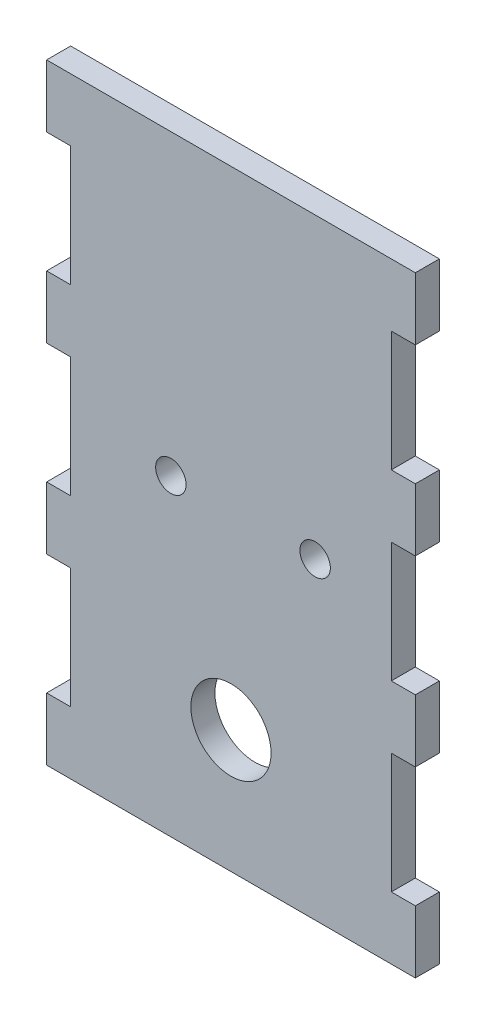
ISO-10303-21;
HEADER;
FILE_DESCRIPTION(('STEP AP214'),'2;1');
FILE_NAME('part.step','',(''),(''),'','','');
FILE_SCHEMA(('AUTOMOTIVE_DESIGN { 1 0 10303 214 1 1 1 1 }'));
ENDSEC;
DATA;
#1=APPLICATION_CONTEXT('core data for automotive mechanical design processes');
#2=APPLICATION_PROTOCOL_DEFINITION('international standard','automotive_design',2000,#1);
#3=PRODUCT_CONTEXT('',#1,'mechanical');
#4=PRODUCT('Part','Part','',(#3));
#5=PRODUCT_RELATED_PRODUCT_CATEGORY('part','',(#4));
#6=PRODUCT_DEFINITION_FORMATION('','',#4);
#7=PRODUCT_DEFINITION_CONTEXT('part definition',#1,'design');
#8=PRODUCT_DEFINITION('design','',#6,#7);
#9=PRODUCT_DEFINITION_SHAPE('','',#8);
#10=(LENGTH_UNIT() NAMED_UNIT(*) SI_UNIT(.MILLI.,.METRE.));
#11=(NAMED_UNIT(*) PLANE_ANGLE_UNIT() SI_UNIT($,.RADIAN.));
#12=(NAMED_UNIT(*) SI_UNIT($,.STERADIAN.) SOLID_ANGLE_UNIT());
#13=UNCERTAINTY_MEASURE_WITH_UNIT(LENGTH_MEASURE(1.E-05),#10,'distance_accuracy_value','');
#14=(GEOMETRIC_REPRESENTATION_CONTEXT(3) GLOBAL_UNCERTAINTY_ASSIGNED_CONTEXT((#13)) GLOBAL_UNIT_ASSIGNED_CONTEXT((#10,
#11,#12)) REPRESENTATION_CONTEXT('',''));
#15=CARTESIAN_POINT('',(0.,0.,0.));
#16=DIRECTION('',(0.,0.,1.));
#17=DIRECTION('',(1.,0.,0.));
#18=AXIS2_PLACEMENT_3D('',#15,#16,#17);
#19=CARTESIAN_POINT('',(5.00653935185185,16.5420138888889,3.));
#20=DIRECTION('',(-1.,0.,0.));
#21=DIRECTION('',(0.,-1.,0.));
#22=AXIS2_PLACEMENT_3D('',#19,#20,#21);
#23=PLANE('',#22);
#24=DIRECTION('',(0.,1.,0.));
#25=VECTOR('',#24,1.);
#26=CARTESIAN_POINT('',(5.00653935185185,16.5420138888889,0.));
#27=LINE('',#26,#25);
#28=CARTESIAN_POINT('',(5.00653935185185,-36.8579861111111,0.));
#29=VERTEX_POINT('',#28);
#30=CARTESIAN_POINT('',(5.00653935185186,-29.0579861111111,0.));
#31=VERTEX_POINT('',#30);
#32=EDGE_CURVE('E237',#29,#31,#27,.T.);
#33=ORIENTED_EDGE('',*,*,#32,.T.);
#34=DIRECTION('',(0.,0.,1.));
#35=VECTOR('',#34,1.);
#36=CARTESIAN_POINT('',(5.00653935185186,-29.0579861111111,0.));
#37=LINE('',#36,#35);
#38=CARTESIAN_POINT('',(5.00653935185186,-29.0579861111111,3.));
#39=VERTEX_POINT('',#38);
#40=EDGE_CURVE('E357',#31,#39,#37,.T.);
#41=ORIENTED_EDGE('',*,*,#40,.T.);
#42=DIRECTION('',(0.,1.,0.));
#43=VECTOR('',#42,1.);
#44=CARTESIAN_POINT('',(5.00653935185185,16.5420138888889,3.));
#45=LINE('',#44,#43);
#46=CARTESIAN_POINT('',(5.00653935185185,-36.8579861111111,3.));
#47=VERTEX_POINT('',#46);
#48=EDGE_CURVE('E239',#47,#39,#45,.T.);
#49=ORIENTED_EDGE('',*,*,#48,.F.);
#50=DIRECTION('',(0.,0.,1.));
#51=VECTOR('',#50,1.);
#52=CARTESIAN_POINT('',(5.00653935185185,-36.8579861111111,0.));
#53=LINE('',#52,#51);
#54=EDGE_CURVE('E224',#29,#47,#53,.T.);
#55=ORIENTED_EDGE('',*,*,#54,.F.);
#56=EDGE_LOOP('',(#33,#41,#49,#55));
#57=FACE_BOUND('',#56,.T.);
#58=ADVANCED_FACE('F35',(#57),#23,.F.);
#59=CARTESIAN_POINT('',(5.00653935185186,-59.6579861111111,0.));
#60=VERTEX_POINT('',#59);
#61=CARTESIAN_POINT('',(5.00653935185185,-51.8579861111111,0.));
#62=VERTEX_POINT('',#61);
#63=EDGE_CURVE('E246',#60,#62,#27,.T.);
#64=ORIENTED_EDGE('',*,*,#63,.T.);
#65=DIRECTION('',(0.,0.,1.));
#66=VECTOR('',#65,1.);
#67=CARTESIAN_POINT('',(5.00653935185185,-51.8579861111111,0.));
#68=LINE('',#67,#66);
#69=CARTESIAN_POINT('',(5.00653935185185,-51.8579861111111,3.));
#70=VERTEX_POINT('',#69);
#71=EDGE_CURVE('E385',#62,#70,#68,.T.);
#72=ORIENTED_EDGE('',*,*,#71,.T.);
#73=CARTESIAN_POINT('',(5.00653935185186,-59.6579861111111,3.));
#74=VERTEX_POINT('',#73);
#75=EDGE_CURVE('E273',#74,#70,#45,.T.);
#76=ORIENTED_EDGE('',*,*,#75,.F.);
#77=DIRECTION('',(0.,0.,-1.));
#78=VECTOR('',#77,1.);
#79=CARTESIAN_POINT('',(5.00653935185186,-59.6579861111111,3.));
#80=LINE('',#79,#78);
#81=EDGE_CURVE('E43',#74,#60,#80,.T.);
#82=ORIENTED_EDGE('',*,*,#81,.T.);
#83=EDGE_LOOP('',(#64,#72,#76,#82));
#84=FACE_BOUND('',#83,.T.);
#85=ADVANCED_FACE('F527',(#84),#23,.F.);
#86=CARTESIAN_POINT('',(-40.9934606481482,16.5420138888889,3.));
#87=DIRECTION('',(1.,0.,0.));
#88=DIRECTION('',(0.,0.,-1.));
#89=AXIS2_PLACEMENT_3D('',#86,#87,#88);
#90=PLANE('',#89);
#91=DIRECTION('',(0.,-1.,0.));
#92=VECTOR('',#91,1.);
#93=CARTESIAN_POINT('',(-40.9934606481482,16.5420138888889,0.));
#94=LINE('',#93,#92);
#95=CARTESIAN_POINT('',(-40.9934606481481,-29.0579861111111,0.));
#96=VERTEX_POINT('',#95);
#97=CARTESIAN_POINT('',(-40.9934606481482,-36.8579861111111,0.));
#98=VERTEX_POINT('',#97);
#99=EDGE_CURVE('E538',#96,#98,#94,.T.);
#100=ORIENTED_EDGE('',*,*,#99,.T.);
#101=DIRECTION('',(0.,0.,1.));
#102=VECTOR('',#101,1.);
#103=CARTESIAN_POINT('',(-40.9934606481482,-36.8579861111111,0.));
#104=LINE('',#103,#102);
#105=CARTESIAN_POINT('',(-40.9934606481482,-36.8579861111111,3.));
#106=VERTEX_POINT('',#105);
#107=EDGE_CURVE('E372',#98,#106,#104,.T.);
#108=ORIENTED_EDGE('',*,*,#107,.T.);
#109=DIRECTION('',(0.,-1.,0.));
#110=VECTOR('',#109,1.);
#111=CARTESIAN_POINT('',(-40.9934606481482,16.5420138888889,3.));
#112=LINE('',#111,#110);
#113=CARTESIAN_POINT('',(-40.9934606481481,-29.0579861111111,3.));
#114=VERTEX_POINT('',#113);
#115=EDGE_CURVE('E516',#114,#106,#112,.T.);
#116=ORIENTED_EDGE('',*,*,#115,.F.);
#117=DIRECTION('',(0.,0.,1.));
#118=VECTOR('',#117,1.);
#119=CARTESIAN_POINT('',(-40.9934606481481,-29.0579861111111,0.));
#120=LINE('',#119,#118);
#121=EDGE_CURVE('E339',#96,#114,#120,.T.);
#122=ORIENTED_EDGE('',*,*,#121,.F.);
#123=EDGE_LOOP('',(#100,#108,#116,#122));
#124=FACE_BOUND('',#123,.T.);
#125=ADVANCED_FACE('F552',(#124),#90,.F.);
#126=CARTESIAN_POINT('',(-40.9934606481481,-6.25798611111111,0.));
#127=VERTEX_POINT('',#126);
#128=CARTESIAN_POINT('',(-40.9934606481482,-14.0579861111111,0.));
#129=VERTEX_POINT('',#128);
#130=EDGE_CURVE('E266',#127,#129,#94,.T.);
#131=ORIENTED_EDGE('',*,*,#130,.T.);
#132=DIRECTION('',(0.,0.,1.));
#133=VECTOR('',#132,1.);
#134=CARTESIAN_POINT('',(-40.9934606481482,-14.0579861111111,0.));
#135=LINE('',#134,#133);
#136=CARTESIAN_POINT('',(-40.9934606481482,-14.0579861111111,3.));
#137=VERTEX_POINT('',#136);
#138=EDGE_CURVE('E306',#129,#137,#135,.T.);
#139=ORIENTED_EDGE('',*,*,#138,.T.);
#140=CARTESIAN_POINT('',(-40.9934606481481,-6.25798611111111,3.));
#141=VERTEX_POINT('',#140);
#142=EDGE_CURVE('E283',#141,#137,#112,.T.);
#143=ORIENTED_EDGE('',*,*,#142,.F.);
#144=DIRECTION('',(0.,0.,1.));
#145=VECTOR('',#144,1.);
#146=CARTESIAN_POINT('',(-40.9934606481481,-6.25798611111111,0.));
#147=LINE('',#146,#145);
#148=EDGE_CURVE('E314',#127,#141,#147,.T.);
#149=ORIENTED_EDGE('',*,*,#148,.F.);
#150=EDGE_LOOP('',(#131,#139,#143,#149));
#151=FACE_BOUND('',#150,.T.);
#152=ADVANCED_FACE('F514',(#151),#90,.F.);
#153=CARTESIAN_POINT('',(-40.9934606481482,16.5420138888889,0.));
#154=VERTEX_POINT('',#153);
#155=CARTESIAN_POINT('',(-40.9934606481482,8.74201388888889,0.));
#156=VERTEX_POINT('',#155);
#157=EDGE_CURVE('E260',#154,#156,#94,.T.);
#158=ORIENTED_EDGE('',*,*,#157,.T.);
#159=DIRECTION('',(0.,0.,1.));
#160=VECTOR('',#159,1.);
#161=CARTESIAN_POINT('',(-40.9934606481482,8.74201388888889,0.));
#162=LINE('',#161,#160);
#163=CARTESIAN_POINT('',(-40.9934606481482,8.74201388888889,3.));
#164=VERTEX_POINT('',#163);
#165=EDGE_CURVE('E321',#156,#164,#162,.T.);
#166=ORIENTED_EDGE('',*,*,#165,.T.);
#167=CARTESIAN_POINT('',(-40.9934606481482,16.5420138888889,3.));
#168=VERTEX_POINT('',#167);
#169=EDGE_CURVE('E280',#168,#164,#112,.T.);
#170=ORIENTED_EDGE('',*,*,#169,.F.);
#171=DIRECTION('',(0.,0.,-1.));
#172=VECTOR('',#171,1.);
#173=CARTESIAN_POINT('',(-40.9934606481482,16.5420138888889,3.));
#174=LINE('',#173,#172);
#175=EDGE_CURVE('E272',#168,#154,#174,.T.);
#176=ORIENTED_EDGE('',*,*,#175,.T.);
#177=EDGE_LOOP('',(#158,#166,#170,#176));
#178=FACE_BOUND('',#177,.T.);
#179=ADVANCED_FACE('F496',(#178),#90,.F.);
#180=CARTESIAN_POINT('',(5.00653935185186,-14.0579861111111,3.));
#181=VERTEX_POINT('',#180);
#182=CARTESIAN_POINT('',(5.00653935185186,-6.25798611111111,3.));
#183=VERTEX_POINT('',#182);
#184=EDGE_CURVE('E276',#181,#183,#45,.T.);
#185=ORIENTED_EDGE('',*,*,#184,.F.);
#186=DIRECTION('',(0.,0.,1.));
#187=VECTOR('',#186,1.);
#188=CARTESIAN_POINT('',(5.00653935185186,-14.0579861111111,0.));
#189=LINE('',#188,#187);
#190=CARTESIAN_POINT('',(5.00653935185186,-14.0579861111111,0.));
#191=VERTEX_POINT('',#190);
#192=EDGE_CURVE('E391',#191,#181,#189,.T.);
#193=ORIENTED_EDGE('',*,*,#192,.F.);
#194=CARTESIAN_POINT('',(5.00653935185186,-6.25798611111111,0.));
#195=VERTEX_POINT('',#194);
#196=EDGE_CURVE('E247',#191,#195,#27,.T.);
#197=ORIENTED_EDGE('',*,*,#196,.T.);
#198=DIRECTION('',(0.,0.,1.));
#199=VECTOR('',#198,1.);
#200=CARTESIAN_POINT('',(5.00653935185186,-6.25798611111111,0.));
#201=LINE('',#200,#199);
#202=EDGE_CURVE('E292',#195,#183,#201,.T.);
#203=ORIENTED_EDGE('',*,*,#202,.T.);
#204=EDGE_LOOP('',(#185,#193,#197,#203));
#205=FACE_BOUND('',#204,.T.);
#206=ADVANCED_FACE('F478',(#205),#23,.F.);
#207=CARTESIAN_POINT('',(-40.9934606481482,-51.8579861111111,3.));
#208=VERTEX_POINT('',#207);
#209=CARTESIAN_POINT('',(-40.9934606481482,-59.6579861111111,3.));
#210=VERTEX_POINT('',#209);
#211=EDGE_CURVE('E284',#208,#210,#112,.T.);
#212=ORIENTED_EDGE('',*,*,#211,.F.);
#213=DIRECTION('',(0.,0.,1.));
#214=VECTOR('',#213,1.);
#215=CARTESIAN_POINT('',(-40.9934606481482,-51.8579861111111,0.));
#216=LINE('',#215,#214);
#217=CARTESIAN_POINT('',(-40.9934606481482,-51.8579861111111,0.));
#218=VERTEX_POINT('',#217);
#219=EDGE_CURVE('E365',#218,#208,#216,.T.);
#220=ORIENTED_EDGE('',*,*,#219,.F.);
#221=CARTESIAN_POINT('',(-40.9934606481482,-59.6579861111111,0.));
#222=VERTEX_POINT('',#221);
#223=EDGE_CURVE('E268',#218,#222,#94,.T.);
#224=ORIENTED_EDGE('',*,*,#223,.T.);
#225=DIRECTION('',(0.,0.,-1.));
#226=VECTOR('',#225,1.);
#227=CARTESIAN_POINT('',(-40.9934606481482,-59.6579861111111,3.));
#228=LINE('',#227,#226);
#229=EDGE_CURVE('E11',#210,#222,#228,.T.);
#230=ORIENTED_EDGE('',*,*,#229,.F.);
#231=EDGE_LOOP('',(#212,#220,#224,#230));
#232=FACE_BOUND('',#231,.T.);
#233=ADVANCED_FACE('F37',(#232),#90,.F.);
#234=CARTESIAN_POINT('',(-40.9934606481482,-59.6579861111111,3.));
#235=DIRECTION('',(0.,1.,0.));
#236=DIRECTION('',(0.,0.,1.));
#237=AXIS2_PLACEMENT_3D('',#234,#235,#236);
#238=PLANE('',#237);
#239=DIRECTION('',(1.,0.,0.));
#240=VECTOR('',#239,1.);
#241=CARTESIAN_POINT('',(-40.9934606481482,-59.6579861111111,0.));
#242=LINE('',#241,#240);
#243=EDGE_CURVE('E254',#222,#60,#242,.T.);
#244=ORIENTED_EDGE('',*,*,#243,.T.);
#245=ORIENTED_EDGE('',*,*,#81,.F.);
#246=DIRECTION('',(1.,0.,0.));
#247=VECTOR('',#246,1.);
#248=CARTESIAN_POINT('',(-40.9934606481482,-59.6579861111111,3.));
#249=LINE('',#248,#247);
#250=EDGE_CURVE('E278',#210,#74,#249,.T.);
#251=ORIENTED_EDGE('',*,*,#250,.F.);
#252=ORIENTED_EDGE('',*,*,#229,.T.);
#253=EDGE_LOOP('',(#244,#245,#251,#252));
#254=FACE_BOUND('',#253,.T.);
#255=ADVANCED_FACE('F535',(#254),#238,.F.);
#256=CARTESIAN_POINT('',(5.00653935185186,8.74201388888887,3.));
#257=VERTEX_POINT('',#256);
#258=CARTESIAN_POINT('',(5.00653935185185,16.5420138888889,3.));
#259=VERTEX_POINT('',#258);
#260=EDGE_CURVE('E277',#257,#259,#45,.T.);
#261=ORIENTED_EDGE('',*,*,#260,.F.);
#262=DIRECTION('',(0.,0.,1.));
#263=VECTOR('',#262,1.);
#264=CARTESIAN_POINT('',(5.00653935185186,8.74201388888887,0.));
#265=LINE('',#264,#263);
#266=CARTESIAN_POINT('',(5.00653935185186,8.74201388888887,0.));
#267=VERTEX_POINT('',#266);
#268=EDGE_CURVE('E285',#267,#257,#265,.T.);
#269=ORIENTED_EDGE('',*,*,#268,.F.);
#270=CARTESIAN_POINT('',(5.00653935185185,16.5420138888889,0.));
#271=VERTEX_POINT('',#270);
#272=EDGE_CURVE('E249',#267,#271,#27,.T.);
#273=ORIENTED_EDGE('',*,*,#272,.T.);
#274=DIRECTION('',(0.,0.,-1.));
#275=VECTOR('',#274,1.);
#276=CARTESIAN_POINT('',(5.00653935185185,16.5420138888889,3.));
#277=LINE('',#276,#275);
#278=EDGE_CURVE('E486',#259,#271,#277,.T.);
#279=ORIENTED_EDGE('',*,*,#278,.F.);
#280=EDGE_LOOP('',(#261,#269,#273,#279));
#281=FACE_BOUND('',#280,.T.);
#282=ADVANCED_FACE('F487',(#281),#23,.F.);
#283=CARTESIAN_POINT('',(-40.9934606481482,16.5420138888889,3.));
#284=DIRECTION('',(0.,-1.,0.));
#285=DIRECTION('',(0.,0.,-1.));
#286=AXIS2_PLACEMENT_3D('',#283,#284,#285);
#287=PLANE('',#286);
#288=DIRECTION('',(-1.,0.,0.));
#289=VECTOR('',#288,1.);
#290=CARTESIAN_POINT('',(-40.9934606481482,16.5420138888889,0.));
#291=LINE('',#290,#289);
#292=EDGE_CURVE('E251',#271,#154,#291,.T.);
#293=ORIENTED_EDGE('',*,*,#292,.T.);
#294=ORIENTED_EDGE('',*,*,#175,.F.);
#295=DIRECTION('',(-1.,0.,0.));
#296=VECTOR('',#295,1.);
#297=CARTESIAN_POINT('',(-40.9934606481482,16.5420138888889,3.));
#298=LINE('',#297,#296);
#299=EDGE_CURVE('E270',#259,#168,#298,.T.);
#300=ORIENTED_EDGE('',*,*,#299,.F.);
#301=ORIENTED_EDGE('',*,*,#278,.T.);
#302=EDGE_LOOP('',(#293,#294,#300,#301));
#303=FACE_BOUND('',#302,.T.);
#304=ADVANCED_FACE('F464',(#303),#287,.F.);
#305=CARTESIAN_POINT('',(0.,0.,3.));
#306=DIRECTION('',(0.,0.,1.));
#307=DIRECTION('',(1.,0.,0.));
#308=AXIS2_PLACEMENT_3D('',#305,#306,#307);
#309=PLANE('',#308);
#310=CARTESIAN_POINT('',(-17.9934606481481,-44.3579861111111,3.));
#311=DIRECTION('',(0.,0.,1.));
#312=DIRECTION('',(1.,0.,0.));
#313=AXIS2_PLACEMENT_3D('',#310,#311,#312);
#314=CIRCLE('',#313,5.);
#315=CARTESIAN_POINT('',(-12.9934606481481,-44.3579861111111,3.));
#316=VERTEX_POINT('',#315);
#317=EDGE_CURVE('E437',#316,#316,#314,.F.);
#318=ORIENTED_EDGE('',*,*,#317,.T.);
#319=EDGE_LOOP('',(#318));
#320=FACE_BOUND('',#319,.T.);
#321=CARTESIAN_POINT('',(-25.4934606481488,-20.6579861111099,3.));
#322=DIRECTION('',(0.,0.,1.));
#323=DIRECTION('',(1.,0.,0.));
#324=AXIS2_PLACEMENT_3D('',#321,#322,#323);
#325=CIRCLE('',#324,1.89864999999999);
#326=CARTESIAN_POINT('',(-23.5948106481488,-20.6579861111099,3.));
#327=VERTEX_POINT('',#326);
#328=EDGE_CURVE('E433',#327,#327,#325,.T.);
#329=ORIENTED_EDGE('',*,*,#328,.F.);
#330=EDGE_LOOP('',(#329));
#331=FACE_BOUND('',#330,.T.);
#332=CARTESIAN_POINT('',(-7.49346064814882,-20.6579861111099,3.));
#333=DIRECTION('',(0.,0.,1.));
#334=DIRECTION('',(1.,0.,0.));
#335=AXIS2_PLACEMENT_3D('',#332,#333,#334);
#336=CIRCLE('',#335,1.89864999999999);
#337=CARTESIAN_POINT('',(-5.59481064814884,-20.6579861111099,3.));
#338=VERTEX_POINT('',#337);
#339=EDGE_CURVE('E427',#338,#338,#336,.T.);
#340=ORIENTED_EDGE('',*,*,#339,.F.);
#341=EDGE_LOOP('',(#340));
#342=FACE_BOUND('',#341,.T.);
#343=DIRECTION('',(1.,0.,0.));
#344=VECTOR('',#343,1.);
#345=CARTESIAN_POINT('',(5.00653935185186,-29.0579861111111,3.));
#346=LINE('',#345,#344);
#347=CARTESIAN_POINT('',(2.00653935185186,-29.0579861111111,3.));
#348=VERTEX_POINT('',#347);
#349=EDGE_CURVE('E398',#348,#39,#346,.T.);
#350=ORIENTED_EDGE('',*,*,#349,.F.);
#351=DIRECTION('',(0.,-1.,0.));
#352=VECTOR('',#351,1.);
#353=CARTESIAN_POINT('',(2.00653935185186,-14.0579861111111,3.));
#354=LINE('',#353,#352);
#355=CARTESIAN_POINT('',(2.00653935185186,-14.0579861111111,3.));
#356=VERTEX_POINT('',#355);
#357=EDGE_CURVE('E401',#356,#348,#354,.T.);
#358=ORIENTED_EDGE('',*,*,#357,.F.);
#359=DIRECTION('',(-1.,0.,0.));
#360=VECTOR('',#359,1.);
#361=CARTESIAN_POINT('',(5.00653935185186,-14.0579861111111,3.));
#362=LINE('',#361,#360);
#363=EDGE_CURVE('E375',#181,#356,#362,.T.);
#364=ORIENTED_EDGE('',*,*,#363,.F.);
#365=ORIENTED_EDGE('',*,*,#184,.T.);
#366=DIRECTION('',(1.,0.,0.));
#367=VECTOR('',#366,1.);
#368=CARTESIAN_POINT('',(5.00653935185186,-6.25798611111111,3.));
#369=LINE('',#368,#367);
#370=CARTESIAN_POINT('',(2.00653935185186,-6.25798611111111,3.));
#371=VERTEX_POINT('',#370);
#372=EDGE_CURVE('E296',#371,#183,#369,.T.);
#373=ORIENTED_EDGE('',*,*,#372,.F.);
#374=DIRECTION('',(0.,-1.,0.));
#375=VECTOR('',#374,1.);
#376=CARTESIAN_POINT('',(2.00653935185186,8.74201388888887,3.));
#377=LINE('',#376,#375);
#378=CARTESIAN_POINT('',(2.00653935185186,8.74201388888887,3.));
#379=VERTEX_POINT('',#378);
#380=EDGE_CURVE('E300',#379,#371,#377,.T.);
#381=ORIENTED_EDGE('',*,*,#380,.F.);
#382=DIRECTION('',(-1.,0.,0.));
#383=VECTOR('',#382,1.);
#384=CARTESIAN_POINT('',(5.00653935185186,8.74201388888887,3.));
#385=LINE('',#384,#383);
#386=EDGE_CURVE('E303',#257,#379,#385,.T.);
#387=ORIENTED_EDGE('',*,*,#386,.F.);
#388=ORIENTED_EDGE('',*,*,#260,.T.);
#389=ORIENTED_EDGE('',*,*,#299,.T.);
#390=ORIENTED_EDGE('',*,*,#169,.T.);
#391=DIRECTION('',(-1.,0.,0.));
#392=VECTOR('',#391,1.);
#393=CARTESIAN_POINT('',(-40.9934606481482,8.74201388888889,3.));
#394=LINE('',#393,#392);
#395=CARTESIAN_POINT('',(-37.9934606481481,8.74201388888889,3.));
#396=VERTEX_POINT('',#395);
#397=EDGE_CURVE('E324',#396,#164,#394,.T.);
#398=ORIENTED_EDGE('',*,*,#397,.F.);
#399=DIRECTION('',(0.,1.,0.));
#400=VECTOR('',#399,1.);
#401=CARTESIAN_POINT('',(-37.9934606481481,8.74201388888889,3.));
#402=LINE('',#401,#400);
#403=CARTESIAN_POINT('',(-37.9934606481481,-6.25798611111111,3.));
#404=VERTEX_POINT('',#403);
#405=EDGE_CURVE('E327',#404,#396,#402,.T.);
#406=ORIENTED_EDGE('',*,*,#405,.F.);
#407=DIRECTION('',(1.,0.,0.));
#408=VECTOR('',#407,1.);
#409=CARTESIAN_POINT('',(-40.9934606481481,-6.25798611111111,3.));
#410=LINE('',#409,#408);
#411=EDGE_CURVE('E295',#141,#404,#410,.T.);
#412=ORIENTED_EDGE('',*,*,#411,.F.);
#413=ORIENTED_EDGE('',*,*,#142,.T.);
#414=DIRECTION('',(-1.,0.,0.));
#415=VECTOR('',#414,1.);
#416=CARTESIAN_POINT('',(-40.9934606481482,-14.0579861111111,3.));
#417=LINE('',#416,#415);
#418=CARTESIAN_POINT('',(-37.9934606481481,-14.0579861111111,3.));
#419=VERTEX_POINT('',#418);
#420=EDGE_CURVE('E348',#419,#137,#417,.T.);
#421=ORIENTED_EDGE('',*,*,#420,.F.);
#422=DIRECTION('',(0.,1.,0.));
#423=VECTOR('',#422,1.);
#424=CARTESIAN_POINT('',(-37.9934606481481,-14.0579861111111,3.));
#425=LINE('',#424,#423);
#426=CARTESIAN_POINT('',(-37.9934606481481,-29.0579861111111,3.));
#427=VERTEX_POINT('',#426);
#428=EDGE_CURVE('E351',#427,#419,#425,.T.);
#429=ORIENTED_EDGE('',*,*,#428,.F.);
#430=DIRECTION('',(1.,0.,0.));
#431=VECTOR('',#430,1.);
#432=CARTESIAN_POINT('',(-40.9934606481481,-29.0579861111111,3.));
#433=LINE('',#432,#431);
#434=EDGE_CURVE('E354',#114,#427,#433,.T.);
#435=ORIENTED_EDGE('',*,*,#434,.F.);
#436=ORIENTED_EDGE('',*,*,#115,.T.);
#437=DIRECTION('',(-1.,0.,0.));
#438=VECTOR('',#437,1.);
#439=CARTESIAN_POINT('',(-40.9934606481482,-36.8579861111111,3.));
#440=LINE('',#439,#438);
#441=CARTESIAN_POINT('',(-37.9934606481482,-36.8579861111111,3.));
#442=VERTEX_POINT('',#441);
#443=EDGE_CURVE('E376',#442,#106,#440,.T.);
#444=ORIENTED_EDGE('',*,*,#443,.F.);
#445=DIRECTION('',(0.,1.,0.));
#446=VECTOR('',#445,1.);
#447=CARTESIAN_POINT('',(-37.9934606481482,-36.8579861111111,3.));
#448=LINE('',#447,#446);
#449=CARTESIAN_POINT('',(-37.9934606481482,-51.8579861111111,3.));
#450=VERTEX_POINT('',#449);
#451=EDGE_CURVE('E379',#450,#442,#448,.T.);
#452=ORIENTED_EDGE('',*,*,#451,.F.);
#453=DIRECTION('',(1.,0.,0.));
#454=VECTOR('',#453,1.);
#455=CARTESIAN_POINT('',(-40.9934606481482,-51.8579861111111,3.));
#456=LINE('',#455,#454);
#457=EDGE_CURVE('E382',#208,#450,#456,.T.);
#458=ORIENTED_EDGE('',*,*,#457,.F.);
#459=ORIENTED_EDGE('',*,*,#211,.T.);
#460=ORIENTED_EDGE('',*,*,#250,.T.);
#461=ORIENTED_EDGE('',*,*,#75,.T.);
#462=DIRECTION('',(1.,0.,0.));
#463=VECTOR('',#462,1.);
#464=CARTESIAN_POINT('',(5.00653935185185,-51.8579861111111,3.));
#465=LINE('',#464,#463);
#466=CARTESIAN_POINT('',(2.00653935185185,-51.8579861111111,3.));
#467=VERTEX_POINT('',#466);
#468=EDGE_CURVE('E231',#467,#70,#465,.T.);
#469=ORIENTED_EDGE('',*,*,#468,.F.);
#470=DIRECTION('',(0.,-1.,0.));
#471=VECTOR('',#470,1.);
#472=CARTESIAN_POINT('',(2.00653935185185,-36.8579861111111,3.));
#473=LINE('',#472,#471);
#474=CARTESIAN_POINT('',(2.00653935185185,-36.8579861111111,3.));
#475=VERTEX_POINT('',#474);
#476=EDGE_CURVE('E416',#475,#467,#473,.T.);
#477=ORIENTED_EDGE('',*,*,#476,.F.);
#478=DIRECTION('',(-1.,0.,0.));
#479=VECTOR('',#478,1.);
#480=CARTESIAN_POINT('',(5.00653935185185,-36.8579861111111,3.));
#481=LINE('',#480,#479);
#482=EDGE_CURVE('E419',#47,#475,#481,.T.);
#483=ORIENTED_EDGE('',*,*,#482,.F.);
#484=ORIENTED_EDGE('',*,*,#48,.T.);
#485=EDGE_LOOP('',(#350,#358,#364,#365,#373,#381,#387,#388,#389,#390,#398,#406,#412,#413,#421,
#429,#435,#436,#444,#452,#458,#459,#460,#461,#469,#477,#483,#484));
#486=FACE_BOUND('',#485,.T.);
#487=ADVANCED_FACE('F448',(#320,#331,#342,#486),#309,.T.);
#488=CARTESIAN_POINT('',(0.,0.,0.));
#489=DIRECTION('',(0.,0.,1.));
#490=DIRECTION('',(1.,0.,0.));
#491=AXIS2_PLACEMENT_3D('',#488,#489,#490);
#492=PLANE('',#491);
#493=CARTESIAN_POINT('',(-17.9934606481481,-44.3579861111111,0.));
#494=DIRECTION('',(0.,0.,-1.));
#495=DIRECTION('',(-1.,0.,0.));
#496=AXIS2_PLACEMENT_3D('',#493,#494,#495);
#497=CIRCLE('',#496,5.);
#498=CARTESIAN_POINT('',(-22.9934606481481,-44.3579861111111,0.));
#499=VERTEX_POINT('',#498);
#500=EDGE_CURVE('E436',#499,#499,#497,.T.);
#501=ORIENTED_EDGE('',*,*,#500,.F.);
#502=EDGE_LOOP('',(#501));
#503=FACE_BOUND('',#502,.T.);
#504=CARTESIAN_POINT('',(-25.4934606481488,-20.6579861111099,0.));
#505=DIRECTION('',(0.,0.,1.));
#506=DIRECTION('',(1.,0.,0.));
#507=AXIS2_PLACEMENT_3D('',#504,#505,#506);
#508=CIRCLE('',#507,1.89864999999999);
#509=CARTESIAN_POINT('',(-23.5948106481488,-20.6579861111099,0.));
#510=VERTEX_POINT('',#509);
#511=EDGE_CURVE('E430',#510,#510,#508,.T.);
#512=ORIENTED_EDGE('',*,*,#511,.T.);
#513=EDGE_LOOP('',(#512));
#514=FACE_BOUND('',#513,.T.);
#515=CARTESIAN_POINT('',(-7.49346064814882,-20.6579861111099,0.));
#516=DIRECTION('',(0.,0.,1.));
#517=DIRECTION('',(1.,0.,0.));
#518=AXIS2_PLACEMENT_3D('',#515,#516,#517);
#519=CIRCLE('',#518,1.89864999999999);
#520=CARTESIAN_POINT('',(-5.59481064814884,-20.6579861111099,0.));
#521=VERTEX_POINT('',#520);
#522=EDGE_CURVE('E421',#521,#521,#519,.T.);
#523=ORIENTED_EDGE('',*,*,#522,.T.);
#524=EDGE_LOOP('',(#523));
#525=FACE_BOUND('',#524,.T.);
#526=DIRECTION('',(0.,-1.,0.));
#527=VECTOR('',#526,1.);
#528=CARTESIAN_POINT('',(2.00653935185186,-14.0579861111111,0.));
#529=LINE('',#528,#527);
#530=CARTESIAN_POINT('',(2.00653935185186,-14.0579861111111,0.));
#531=VERTEX_POINT('',#530);
#532=CARTESIAN_POINT('',(2.00653935185186,-29.0579861111111,0.));
#533=VERTEX_POINT('',#532);
#534=EDGE_CURVE('E50',#531,#533,#529,.T.);
#535=ORIENTED_EDGE('',*,*,#534,.T.);
#536=DIRECTION('',(1.,0.,0.));
#537=VECTOR('',#536,1.);
#538=CARTESIAN_POINT('',(5.00653935185186,-29.0579861111111,0.));
#539=LINE('',#538,#537);
#540=EDGE_CURVE('E245',#533,#31,#539,.T.);
#541=ORIENTED_EDGE('',*,*,#540,.T.);
#542=ORIENTED_EDGE('',*,*,#32,.F.);
#543=DIRECTION('',(-1.,0.,0.));
#544=VECTOR('',#543,1.);
#545=CARTESIAN_POINT('',(5.00653935185185,-36.8579861111111,0.));
#546=LINE('',#545,#544);
#547=CARTESIAN_POINT('',(2.00653935185185,-36.8579861111111,0.));
#548=VERTEX_POINT('',#547);
#549=EDGE_CURVE('E220',#29,#548,#546,.T.);
#550=ORIENTED_EDGE('',*,*,#549,.T.);
#551=DIRECTION('',(0.,-1.,0.));
#552=VECTOR('',#551,1.);
#553=CARTESIAN_POINT('',(2.00653935185185,-36.8579861111111,0.));
#554=LINE('',#553,#552);
#555=CARTESIAN_POINT('',(2.00653935185185,-51.8579861111111,0.));
#556=VERTEX_POINT('',#555);
#557=EDGE_CURVE('E230',#548,#556,#554,.T.);
#558=ORIENTED_EDGE('',*,*,#557,.T.);
#559=DIRECTION('',(1.,0.,0.));
#560=VECTOR('',#559,1.);
#561=CARTESIAN_POINT('',(5.00653935185185,-51.8579861111111,0.));
#562=LINE('',#561,#560);
#563=EDGE_CURVE('E240',#556,#62,#562,.T.);
#564=ORIENTED_EDGE('',*,*,#563,.T.);
#565=ORIENTED_EDGE('',*,*,#63,.F.);
#566=ORIENTED_EDGE('',*,*,#243,.F.);
#567=ORIENTED_EDGE('',*,*,#223,.F.);
#568=DIRECTION('',(1.,0.,0.));
#569=VECTOR('',#568,1.);
#570=CARTESIAN_POINT('',(-40.9934606481482,-51.8579861111111,0.));
#571=LINE('',#570,#569);
#572=CARTESIAN_POINT('',(-37.9934606481482,-51.8579861111111,0.));
#573=VERTEX_POINT('',#572);
#574=EDGE_CURVE('E378',#218,#573,#571,.T.);
#575=ORIENTED_EDGE('',*,*,#574,.T.);
#576=DIRECTION('',(0.,1.,0.));
#577=VECTOR('',#576,1.);
#578=CARTESIAN_POINT('',(-37.9934606481482,-36.8579861111111,0.));
#579=LINE('',#578,#577);
#580=CARTESIAN_POINT('',(-37.9934606481482,-36.8579861111111,0.));
#581=VERTEX_POINT('',#580);
#582=EDGE_CURVE('E58',#573,#581,#579,.T.);
#583=ORIENTED_EDGE('',*,*,#582,.T.);
#584=DIRECTION('',(-1.,0.,0.));
#585=VECTOR('',#584,1.);
#586=CARTESIAN_POINT('',(-40.9934606481482,-36.8579861111111,0.));
#587=LINE('',#586,#585);
#588=EDGE_CURVE('E368',#581,#98,#587,.T.);
#589=ORIENTED_EDGE('',*,*,#588,.T.);
#590=ORIENTED_EDGE('',*,*,#99,.F.);
#591=DIRECTION('',(1.,0.,0.));
#592=VECTOR('',#591,1.);
#593=CARTESIAN_POINT('',(-40.9934606481481,-29.0579861111111,0.));
#594=LINE('',#593,#592);
#595=CARTESIAN_POINT('',(-37.9934606481481,-29.0579861111111,0.));
#596=VERTEX_POINT('',#595);
#597=EDGE_CURVE('E350',#96,#596,#594,.T.);
#598=ORIENTED_EDGE('',*,*,#597,.T.);
#599=DIRECTION('',(0.,1.,0.));
#600=VECTOR('',#599,1.);
#601=CARTESIAN_POINT('',(-37.9934606481481,-14.0579861111111,0.));
#602=LINE('',#601,#600);
#603=CARTESIAN_POINT('',(-37.9934606481481,-14.0579861111111,0.));
#604=VERTEX_POINT('',#603);
#605=EDGE_CURVE('E360',#596,#604,#602,.T.);
#606=ORIENTED_EDGE('',*,*,#605,.T.);
#607=DIRECTION('',(-1.,0.,0.));
#608=VECTOR('',#607,1.);
#609=CARTESIAN_POINT('',(-40.9934606481482,-14.0579861111111,0.));
#610=LINE('',#609,#608);
#611=EDGE_CURVE('E342',#604,#129,#610,.T.);
#612=ORIENTED_EDGE('',*,*,#611,.T.);
#613=ORIENTED_EDGE('',*,*,#130,.F.);
#614=DIRECTION('',(1.,0.,0.));
#615=VECTOR('',#614,1.);
#616=CARTESIAN_POINT('',(-40.9934606481481,-6.25798611111111,0.));
#617=LINE('',#616,#615);
#618=CARTESIAN_POINT('',(-37.9934606481481,-6.25798611111111,0.));
#619=VERTEX_POINT('',#618);
#620=EDGE_CURVE('E326',#127,#619,#617,.T.);
#621=ORIENTED_EDGE('',*,*,#620,.T.);
#622=DIRECTION('',(0.,1.,0.));
#623=VECTOR('',#622,1.);
#624=CARTESIAN_POINT('',(-37.9934606481481,8.74201388888889,0.));
#625=LINE('',#624,#623);
#626=CARTESIAN_POINT('',(-37.9934606481481,8.74201388888889,0.));
#627=VERTEX_POINT('',#626);
#628=EDGE_CURVE('E334',#619,#627,#625,.T.);
#629=ORIENTED_EDGE('',*,*,#628,.T.);
#630=DIRECTION('',(-1.,0.,0.));
#631=VECTOR('',#630,1.);
#632=CARTESIAN_POINT('',(-40.9934606481482,8.74201388888889,0.));
#633=LINE('',#632,#631);
#634=EDGE_CURVE('E317',#627,#156,#633,.T.);
#635=ORIENTED_EDGE('',*,*,#634,.T.);
#636=ORIENTED_EDGE('',*,*,#157,.F.);
#637=ORIENTED_EDGE('',*,*,#292,.F.);
#638=ORIENTED_EDGE('',*,*,#272,.F.);
#639=DIRECTION('',(-1.,0.,0.));
#640=VECTOR('',#639,1.);
#641=CARTESIAN_POINT('',(5.00653935185186,8.74201388888887,0.));
#642=LINE('',#641,#640);
#643=CARTESIAN_POINT('',(2.00653935185186,8.74201388888887,0.));
#644=VERTEX_POINT('',#643);
#645=EDGE_CURVE('E299',#267,#644,#642,.T.);
#646=ORIENTED_EDGE('',*,*,#645,.T.);
#647=DIRECTION('',(0.,-1.,0.));
#648=VECTOR('',#647,1.);
#649=CARTESIAN_POINT('',(2.00653935185186,8.74201388888887,0.));
#650=LINE('',#649,#648);
#651=CARTESIAN_POINT('',(2.00653935185186,-6.25798611111111,0.));
#652=VERTEX_POINT('',#651);
#653=EDGE_CURVE('E309',#644,#652,#650,.T.);
#654=ORIENTED_EDGE('',*,*,#653,.T.);
#655=DIRECTION('',(1.,0.,0.));
#656=VECTOR('',#655,1.);
#657=CARTESIAN_POINT('',(5.00653935185186,-6.25798611111111,0.));
#658=LINE('',#657,#656);
#659=EDGE_CURVE('E288',#652,#195,#658,.T.);
#660=ORIENTED_EDGE('',*,*,#659,.T.);
#661=ORIENTED_EDGE('',*,*,#196,.F.);
#662=DIRECTION('',(-1.,0.,0.));
#663=VECTOR('',#662,1.);
#664=CARTESIAN_POINT('',(5.00653935185186,-14.0579861111111,0.));
#665=LINE('',#664,#663);
#666=EDGE_CURVE('E400',#191,#531,#665,.T.);
#667=ORIENTED_EDGE('',*,*,#666,.T.);
#668=EDGE_LOOP('',(#535,#541,#542,#550,#558,#564,#565,#566,#567,#575,#583,#589,#590,#598,#606,
#612,#613,#621,#629,#635,#636,#637,#638,#646,#654,#660,#661,#667));
#669=FACE_BOUND('',#668,.T.);
#670=ADVANCED_FACE('F243',(#503,#514,#525,#669),#492,.F.);
#671=CARTESIAN_POINT('',(5.00653935185186,-6.25798611111111,0.));
#672=DIRECTION('',(0.,-1.,0.));
#673=DIRECTION('',(0.,0.,-1.));
#674=AXIS2_PLACEMENT_3D('',#671,#672,#673);
#675=PLANE('',#674);
#676=ORIENTED_EDGE('',*,*,#372,.T.);
#677=ORIENTED_EDGE('',*,*,#202,.F.);
#678=ORIENTED_EDGE('',*,*,#659,.F.);
#679=DIRECTION('',(0.,0.,1.));
#680=VECTOR('',#679,1.);
#681=CARTESIAN_POINT('',(2.00653935185186,-6.25798611111111,0.));
#682=LINE('',#681,#680);
#683=EDGE_CURVE('E290',#652,#371,#682,.T.);
#684=ORIENTED_EDGE('',*,*,#683,.T.);
#685=EDGE_LOOP('',(#676,#677,#678,#684));
#686=FACE_BOUND('',#685,.T.);
#687=ADVANCED_FACE('F447',(#686),#675,.F.);
#688=CARTESIAN_POINT('',(2.00653935185186,8.74201388888887,0.));
#689=DIRECTION('',(-1.,0.,0.));
#690=DIRECTION('',(0.,0.,1.));
#691=AXIS2_PLACEMENT_3D('',#688,#689,#690);
#692=PLANE('',#691);
#693=ORIENTED_EDGE('',*,*,#380,.T.);
#694=ORIENTED_EDGE('',*,*,#683,.F.);
#695=ORIENTED_EDGE('',*,*,#653,.F.);
#696=DIRECTION('',(0.,0.,1.));
#697=VECTOR('',#696,1.);
#698=CARTESIAN_POINT('',(2.00653935185186,8.74201388888887,0.));
#699=LINE('',#698,#697);
#700=EDGE_CURVE('E287',#644,#379,#699,.T.);
#701=ORIENTED_EDGE('',*,*,#700,.T.);
#702=EDGE_LOOP('',(#693,#694,#695,#701));
#703=FACE_BOUND('',#702,.T.);
#704=ADVANCED_FACE('F638',(#703),#692,.F.);
#705=CARTESIAN_POINT('',(5.00653935185186,8.74201388888887,0.));
#706=DIRECTION('',(0.,1.,0.));
#707=DIRECTION('',(-1.,0.,0.));
#708=AXIS2_PLACEMENT_3D('',#705,#706,#707);
#709=PLANE('',#708);
#710=ORIENTED_EDGE('',*,*,#386,.T.);
#711=ORIENTED_EDGE('',*,*,#700,.F.);
#712=ORIENTED_EDGE('',*,*,#645,.F.);
#713=ORIENTED_EDGE('',*,*,#268,.T.);
#714=EDGE_LOOP('',(#710,#711,#712,#713));
#715=FACE_BOUND('',#714,.T.);
#716=ADVANCED_FACE('F629',(#715),#709,.F.);
#717=CARTESIAN_POINT('',(-40.9934606481482,8.74201388888889,0.));
#718=DIRECTION('',(0.,1.,0.));
#719=DIRECTION('',(0.,0.,1.));
#720=AXIS2_PLACEMENT_3D('',#717,#718,#719);
#721=PLANE('',#720);
#722=ORIENTED_EDGE('',*,*,#397,.T.);
#723=ORIENTED_EDGE('',*,*,#165,.F.);
#724=ORIENTED_EDGE('',*,*,#634,.F.);
#725=DIRECTION('',(0.,0.,1.));
#726=VECTOR('',#725,1.);
#727=CARTESIAN_POINT('',(-37.9934606481481,8.74201388888889,0.));
#728=LINE('',#727,#726);
#729=EDGE_CURVE('E319',#627,#396,#728,.T.);
#730=ORIENTED_EDGE('',*,*,#729,.T.);
#731=EDGE_LOOP('',(#722,#723,#724,#730));
#732=FACE_BOUND('',#731,.T.);
#733=ADVANCED_FACE('F501',(#732),#721,.F.);
#734=CARTESIAN_POINT('',(-37.9934606481481,8.74201388888889,0.));
#735=DIRECTION('',(1.,0.,0.));
#736=DIRECTION('',(0.,0.,-1.));
#737=AXIS2_PLACEMENT_3D('',#734,#735,#736);
#738=PLANE('',#737);
#739=ORIENTED_EDGE('',*,*,#405,.T.);
#740=ORIENTED_EDGE('',*,*,#729,.F.);
#741=ORIENTED_EDGE('',*,*,#628,.F.);
#742=DIRECTION('',(0.,0.,1.));
#743=VECTOR('',#742,1.);
#744=CARTESIAN_POINT('',(-37.9934606481481,-6.25798611111111,0.));
#745=LINE('',#744,#743);
#746=EDGE_CURVE('E316',#619,#404,#745,.T.);
#747=ORIENTED_EDGE('',*,*,#746,.T.);
#748=EDGE_LOOP('',(#739,#740,#741,#747));
#749=FACE_BOUND('',#748,.T.);
#750=ADVANCED_FACE('F504',(#749),#738,.F.);
#751=CARTESIAN_POINT('',(-40.9934606481481,-6.25798611111111,0.));
#752=DIRECTION('',(0.,-1.,0.));
#753=DIRECTION('',(1.,0.,0.));
#754=AXIS2_PLACEMENT_3D('',#751,#752,#753);
#755=PLANE('',#754);
#756=ORIENTED_EDGE('',*,*,#411,.T.);
#757=ORIENTED_EDGE('',*,*,#746,.F.);
#758=ORIENTED_EDGE('',*,*,#620,.F.);
#759=ORIENTED_EDGE('',*,*,#148,.T.);
#760=EDGE_LOOP('',(#756,#757,#758,#759));
#761=FACE_BOUND('',#760,.T.);
#762=ADVANCED_FACE('F507',(#761),#755,.F.);
#763=CARTESIAN_POINT('',(-40.9934606481482,-14.0579861111111,0.));
#764=DIRECTION('',(0.,1.,0.));
#765=DIRECTION('',(0.,0.,1.));
#766=AXIS2_PLACEMENT_3D('',#763,#764,#765);
#767=PLANE('',#766);
#768=ORIENTED_EDGE('',*,*,#420,.T.);
#769=ORIENTED_EDGE('',*,*,#138,.F.);
#770=ORIENTED_EDGE('',*,*,#611,.F.);
#771=DIRECTION('',(0.,0.,1.));
#772=VECTOR('',#771,1.);
#773=CARTESIAN_POINT('',(-37.9934606481481,-14.0579861111111,0.));
#774=LINE('',#773,#772);
#775=EDGE_CURVE('E344',#604,#419,#774,.T.);
#776=ORIENTED_EDGE('',*,*,#775,.T.);
#777=EDGE_LOOP('',(#768,#769,#770,#776));
#778=FACE_BOUND('',#777,.T.);
#779=ADVANCED_FACE('F545',(#778),#767,.F.);
#780=CARTESIAN_POINT('',(-37.9934606481481,-14.0579861111111,0.));
#781=DIRECTION('',(1.,0.,0.));
#782=DIRECTION('',(0.,0.,-1.));
#783=AXIS2_PLACEMENT_3D('',#780,#781,#782);
#784=PLANE('',#783);
#785=ORIENTED_EDGE('',*,*,#428,.T.);
#786=ORIENTED_EDGE('',*,*,#775,.F.);
#787=ORIENTED_EDGE('',*,*,#605,.F.);
#788=DIRECTION('',(0.,0.,1.));
#789=VECTOR('',#788,1.);
#790=CARTESIAN_POINT('',(-37.9934606481481,-29.0579861111111,0.));
#791=LINE('',#790,#789);
#792=EDGE_CURVE('E341',#596,#427,#791,.T.);
#793=ORIENTED_EDGE('',*,*,#792,.T.);
#794=EDGE_LOOP('',(#785,#786,#787,#793));
#795=FACE_BOUND('',#794,.T.);
#796=ADVANCED_FACE('F548',(#795),#784,.F.);
#797=CARTESIAN_POINT('',(-40.9934606481481,-29.0579861111111,0.));
#798=DIRECTION('',(0.,-1.,0.));
#799=DIRECTION('',(1.,0.,0.));
#800=AXIS2_PLACEMENT_3D('',#797,#798,#799);
#801=PLANE('',#800);
#802=ORIENTED_EDGE('',*,*,#434,.T.);
#803=ORIENTED_EDGE('',*,*,#792,.F.);
#804=ORIENTED_EDGE('',*,*,#597,.F.);
#805=ORIENTED_EDGE('',*,*,#121,.T.);
#806=EDGE_LOOP('',(#802,#803,#804,#805));
#807=FACE_BOUND('',#806,.T.);
#808=ADVANCED_FACE('F551',(#807),#801,.F.);
#809=CARTESIAN_POINT('',(5.00653935185185,-51.8579861111111,0.));
#810=DIRECTION('',(0.,-1.,0.));
#811=DIRECTION('',(0.,0.,-1.));
#812=AXIS2_PLACEMENT_3D('',#809,#810,#811);
#813=PLANE('',#812);
#814=ORIENTED_EDGE('',*,*,#468,.T.);
#815=ORIENTED_EDGE('',*,*,#71,.F.);
#816=ORIENTED_EDGE('',*,*,#563,.F.);
#817=DIRECTION('',(0.,0.,1.));
#818=VECTOR('',#817,1.);
#819=CARTESIAN_POINT('',(2.00653935185185,-51.8579861111111,0.));
#820=LINE('',#819,#818);
#821=EDGE_CURVE('E411',#556,#467,#820,.T.);
#822=ORIENTED_EDGE('',*,*,#821,.T.);
#823=EDGE_LOOP('',(#814,#815,#816,#822));
#824=FACE_BOUND('',#823,.T.);
#825=ADVANCED_FACE('F531',(#824),#813,.F.);
#826=CARTESIAN_POINT('',(2.00653935185185,-36.8579861111111,0.));
#827=DIRECTION('',(-1.,0.,0.));
#828=DIRECTION('',(0.,0.,1.));
#829=AXIS2_PLACEMENT_3D('',#826,#827,#828);
#830=PLANE('',#829);
#831=ORIENTED_EDGE('',*,*,#476,.T.);
#832=ORIENTED_EDGE('',*,*,#821,.F.);
#833=ORIENTED_EDGE('',*,*,#557,.F.);
#834=DIRECTION('',(0.,0.,1.));
#835=VECTOR('',#834,1.);
#836=CARTESIAN_POINT('',(2.00653935185185,-36.8579861111111,0.));
#837=LINE('',#836,#835);
#838=EDGE_CURVE('E226',#548,#475,#837,.T.);
#839=ORIENTED_EDGE('',*,*,#838,.T.);
#840=EDGE_LOOP('',(#831,#832,#833,#839));
#841=FACE_BOUND('',#840,.T.);
#842=ADVANCED_FACE('F718',(#841),#830,.F.);
#843=CARTESIAN_POINT('',(5.00653935185185,-36.8579861111111,0.));
#844=DIRECTION('',(0.,1.,0.));
#845=DIRECTION('',(-1.,0.,0.));
#846=AXIS2_PLACEMENT_3D('',#843,#844,#845);
#847=PLANE('',#846);
#848=ORIENTED_EDGE('',*,*,#482,.T.);
#849=ORIENTED_EDGE('',*,*,#838,.F.);
#850=ORIENTED_EDGE('',*,*,#549,.F.);
#851=ORIENTED_EDGE('',*,*,#54,.T.);
#852=EDGE_LOOP('',(#848,#849,#850,#851));
#853=FACE_BOUND('',#852,.T.);
#854=ADVANCED_FACE('F223',(#853),#847,.F.);
#855=CARTESIAN_POINT('',(-40.9934606481482,-36.8579861111111,0.));
#856=DIRECTION('',(0.,1.,0.));
#857=DIRECTION('',(0.,0.,1.));
#858=AXIS2_PLACEMENT_3D('',#855,#856,#857);
#859=PLANE('',#858);
#860=ORIENTED_EDGE('',*,*,#443,.T.);
#861=ORIENTED_EDGE('',*,*,#107,.F.);
#862=ORIENTED_EDGE('',*,*,#588,.F.);
#863=DIRECTION('',(0.,0.,1.));
#864=VECTOR('',#863,1.);
#865=CARTESIAN_POINT('',(-37.9934606481482,-36.8579861111111,0.));
#866=LINE('',#865,#864);
#867=EDGE_CURVE('E370',#581,#442,#866,.T.);
#868=ORIENTED_EDGE('',*,*,#867,.T.);
#869=EDGE_LOOP('',(#860,#861,#862,#868));
#870=FACE_BOUND('',#869,.T.);
#871=ADVANCED_FACE('F555',(#870),#859,.F.);
#872=CARTESIAN_POINT('',(-37.9934606481482,-36.8579861111111,0.));
#873=DIRECTION('',(1.,0.,0.));
#874=DIRECTION('',(0.,0.,-1.));
#875=AXIS2_PLACEMENT_3D('',#872,#873,#874);
#876=PLANE('',#875);
#877=ORIENTED_EDGE('',*,*,#451,.T.);
#878=ORIENTED_EDGE('',*,*,#867,.F.);
#879=ORIENTED_EDGE('',*,*,#582,.F.);
#880=DIRECTION('',(0.,0.,1.));
#881=VECTOR('',#880,1.);
#882=CARTESIAN_POINT('',(-37.9934606481482,-51.8579861111111,0.));
#883=LINE('',#882,#881);
#884=EDGE_CURVE('E367',#573,#450,#883,.T.);
#885=ORIENTED_EDGE('',*,*,#884,.T.);
#886=EDGE_LOOP('',(#877,#878,#879,#885));
#887=FACE_BOUND('',#886,.T.);
#888=ADVANCED_FACE('F557',(#887),#876,.F.);
#889=CARTESIAN_POINT('',(-40.9934606481482,-51.8579861111111,0.));
#890=DIRECTION('',(0.,-1.,0.));
#891=DIRECTION('',(1.,0.,0.));
#892=AXIS2_PLACEMENT_3D('',#889,#890,#891);
#893=PLANE('',#892);
#894=ORIENTED_EDGE('',*,*,#457,.T.);
#895=ORIENTED_EDGE('',*,*,#884,.F.);
#896=ORIENTED_EDGE('',*,*,#574,.F.);
#897=ORIENTED_EDGE('',*,*,#219,.T.);
#898=EDGE_LOOP('',(#894,#895,#896,#897));
#899=FACE_BOUND('',#898,.T.);
#900=ADVANCED_FACE('F559',(#899),#893,.F.);
#901=CARTESIAN_POINT('',(5.00653935185186,-29.0579861111111,0.));
#902=DIRECTION('',(0.,-1.,0.));
#903=DIRECTION('',(0.,0.,-1.));
#904=AXIS2_PLACEMENT_3D('',#901,#902,#903);
#905=PLANE('',#904);
#906=ORIENTED_EDGE('',*,*,#349,.T.);
#907=ORIENTED_EDGE('',*,*,#40,.F.);
#908=ORIENTED_EDGE('',*,*,#540,.F.);
#909=DIRECTION('',(0.,0.,1.));
#910=VECTOR('',#909,1.);
#911=CARTESIAN_POINT('',(2.00653935185186,-29.0579861111111,0.));
#912=LINE('',#911,#910);
#913=EDGE_CURVE('E395',#533,#348,#912,.T.);
#914=ORIENTED_EDGE('',*,*,#913,.T.);
#915=EDGE_LOOP('',(#906,#907,#908,#914));
#916=FACE_BOUND('',#915,.T.);
#917=ADVANCED_FACE('F471',(#916),#905,.F.);
#918=CARTESIAN_POINT('',(2.00653935185186,-14.0579861111111,0.));
#919=DIRECTION('',(-1.,0.,0.));
#920=DIRECTION('',(0.,0.,1.));
#921=AXIS2_PLACEMENT_3D('',#918,#919,#920);
#922=PLANE('',#921);
#923=ORIENTED_EDGE('',*,*,#357,.T.);
#924=ORIENTED_EDGE('',*,*,#913,.F.);
#925=ORIENTED_EDGE('',*,*,#534,.F.);
#926=DIRECTION('',(0.,0.,1.));
#927=VECTOR('',#926,1.);
#928=CARTESIAN_POINT('',(2.00653935185186,-14.0579861111111,0.));
#929=LINE('',#928,#927);
#930=EDGE_CURVE('E393',#531,#356,#929,.T.);
#931=ORIENTED_EDGE('',*,*,#930,.T.);
#932=EDGE_LOOP('',(#923,#924,#925,#931));
#933=FACE_BOUND('',#932,.T.);
#934=ADVANCED_FACE('F472',(#933),#922,.F.);
#935=CARTESIAN_POINT('',(5.00653935185186,-14.0579861111111,0.));
#936=DIRECTION('',(0.,1.,0.));
#937=DIRECTION('',(-1.,0.,0.));
#938=AXIS2_PLACEMENT_3D('',#935,#936,#937);
#939=PLANE('',#938);
#940=ORIENTED_EDGE('',*,*,#363,.T.);
#941=ORIENTED_EDGE('',*,*,#930,.F.);
#942=ORIENTED_EDGE('',*,*,#666,.F.);
#943=ORIENTED_EDGE('',*,*,#192,.T.);
#944=EDGE_LOOP('',(#940,#941,#942,#943));
#945=FACE_BOUND('',#944,.T.);
#946=ADVANCED_FACE('F458',(#945),#939,.F.);
#947=CARTESIAN_POINT('',(-7.49346064814882,-20.6579861111099,3.));
#948=DIRECTION('',(0.,0.,1.));
#949=DIRECTION('',(1.,0.,0.));
#950=AXIS2_PLACEMENT_3D('',#947,#948,#949);
#951=CYLINDRICAL_SURFACE('',#950,1.89864999999999);
#952=ORIENTED_EDGE('',*,*,#522,.F.);
#953=EDGE_LOOP('',(#952));
#954=FACE_BOUND('',#953,.T.);
#955=ORIENTED_EDGE('',*,*,#339,.T.);
#956=EDGE_LOOP('',(#955));
#957=FACE_BOUND('',#956,.T.);
#958=ADVANCED_FACE('F454',(#954,#957),#951,.F.);
#959=CARTESIAN_POINT('',(-25.4934606481488,-20.6579861111099,3.));
#960=DIRECTION('',(0.,0.,1.));
#961=DIRECTION('',(1.,0.,0.));
#962=AXIS2_PLACEMENT_3D('',#959,#960,#961);
#963=CYLINDRICAL_SURFACE('',#962,1.89864999999999);
#964=ORIENTED_EDGE('',*,*,#511,.F.);
#965=EDGE_LOOP('',(#964));
#966=FACE_BOUND('',#965,.T.);
#967=ORIENTED_EDGE('',*,*,#328,.T.);
#968=EDGE_LOOP('',(#967));
#969=FACE_BOUND('',#968,.T.);
#970=ADVANCED_FACE('F457',(#966,#969),#963,.F.);
#971=CARTESIAN_POINT('',(-17.9934606481481,-44.3579861111111,3.001));
#972=DIRECTION('',(0.,0.,-1.));
#973=DIRECTION('',(-1.,0.,0.));
#974=AXIS2_PLACEMENT_3D('',#971,#972,#973);
#975=CYLINDRICAL_SURFACE('',#974,5.);
#976=ORIENTED_EDGE('',*,*,#317,.F.);
#977=EDGE_LOOP('',(#976));
#978=FACE_BOUND('',#977,.T.);
#979=ORIENTED_EDGE('',*,*,#500,.T.);
#980=EDGE_LOOP('',(#979));
#981=FACE_BOUND('',#980,.T.);
#982=ADVANCED_FACE('F443',(#978,#981),#975,.F.);
#983=CLOSED_SHELL('',(#58,#85,#125,#152,#179,#206,#233,#255,#282,#304,#487,#670,#687,#704,#716,
#733,#750,#762,#779,#796,#808,#825,#842,#854,#871,#888,#900,#917,#934,#946,#958,#970,#982));
#984=MANIFOLD_SOLID_BREP('B2',#983);
#985=ADVANCED_BREP_SHAPE_REPRESENTATION('',(#18,#984),#14);
#986=SHAPE_DEFINITION_REPRESENTATION(#9,#985);
ENDSEC;
END-ISO-10303-21;
